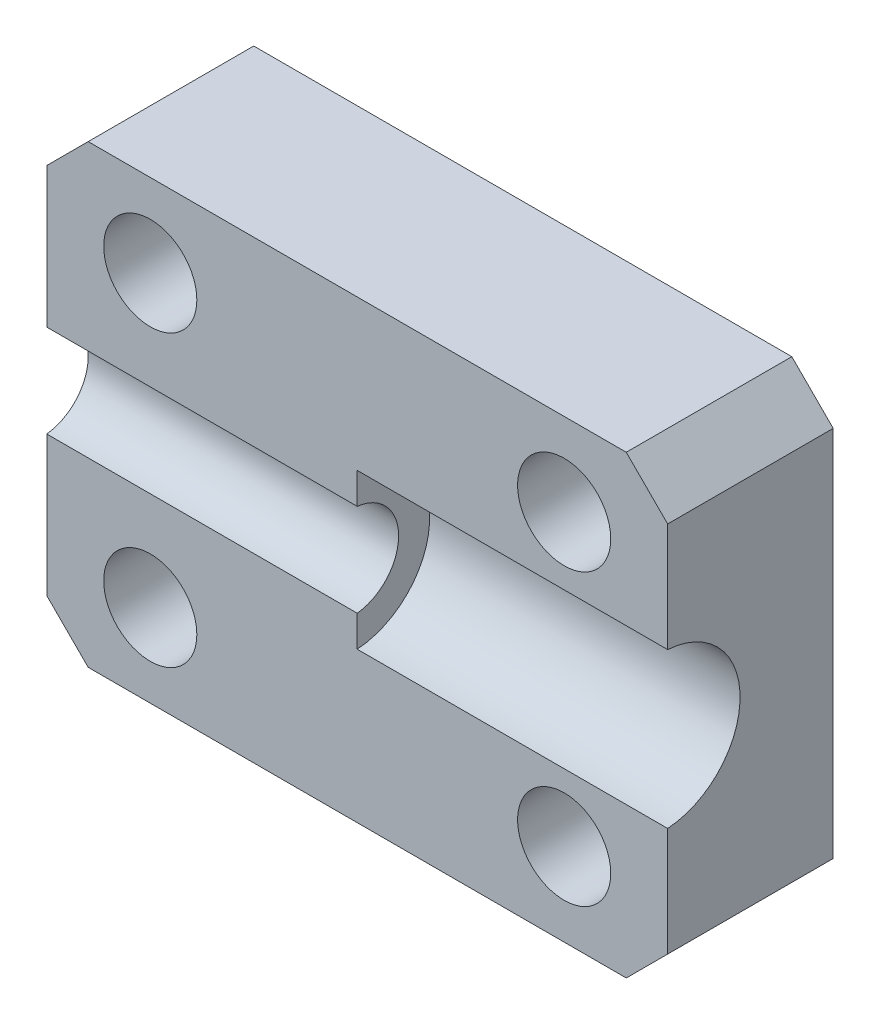
ISO-10303-21;
HEADER;
FILE_DESCRIPTION(('STEP AP214'),'2;1');
FILE_NAME('part.step','',(''),(''),'','','');
FILE_SCHEMA(('AUTOMOTIVE_DESIGN { 1 0 10303 214 1 1 1 1 }'));
ENDSEC;
DATA;
#1=APPLICATION_CONTEXT('core data for automotive mechanical design processes');
#2=APPLICATION_PROTOCOL_DEFINITION('international standard','automotive_design',2000,#1);
#3=PRODUCT_CONTEXT('',#1,'mechanical');
#4=PRODUCT('Part','Part','',(#3));
#5=PRODUCT_RELATED_PRODUCT_CATEGORY('part','',(#4));
#6=PRODUCT_DEFINITION_FORMATION('','',#4);
#7=PRODUCT_DEFINITION_CONTEXT('part definition',#1,'design');
#8=PRODUCT_DEFINITION('design','',#6,#7);
#9=PRODUCT_DEFINITION_SHAPE('','',#8);
#10=(LENGTH_UNIT() NAMED_UNIT(*) SI_UNIT(.MILLI.,.METRE.));
#11=(NAMED_UNIT(*) PLANE_ANGLE_UNIT() SI_UNIT($,.RADIAN.));
#12=(NAMED_UNIT(*) SI_UNIT($,.STERADIAN.) SOLID_ANGLE_UNIT());
#13=UNCERTAINTY_MEASURE_WITH_UNIT(LENGTH_MEASURE(1.E-05),#10,'distance_accuracy_value','');
#14=(GEOMETRIC_REPRESENTATION_CONTEXT(3) GLOBAL_UNCERTAINTY_ASSIGNED_CONTEXT((#13)) GLOBAL_UNIT_ASSIGNED_CONTEXT((#10,
#11,#12)) REPRESENTATION_CONTEXT('',''));
#15=CARTESIAN_POINT('',(0.,0.,0.));
#16=DIRECTION('',(0.,0.,1.));
#17=DIRECTION('',(1.,0.,0.));
#18=AXIS2_PLACEMENT_3D('',#15,#16,#17);
#19=CARTESIAN_POINT('',(-15.001,0.,8.25));
#20=DIRECTION('',(1.,0.,0.));
#21=DIRECTION('',(0.,1.,0.));
#22=AXIS2_PLACEMENT_3D('',#19,#20,#21);
#23=CYLINDRICAL_SURFACE('',#22,2.25);
#24=CARTESIAN_POINT('',(0.,0.,8.25));
#25=DIRECTION('',(1.,0.,0.));
#26=DIRECTION('',(0.,1.,0.));
#27=AXIS2_PLACEMENT_3D('',#24,#25,#26);
#28=CIRCLE('',#27,2.25);
#29=CARTESIAN_POINT('',(0.,2.23606797749978,8.));
#30=VERTEX_POINT('',#29);
#31=CARTESIAN_POINT('',(0.,-2.2360679774998,8.));
#32=VERTEX_POINT('',#31);
#33=EDGE_CURVE('E11',#30,#32,#28,.F.);
#34=ORIENTED_EDGE('',*,*,#33,.F.);
#35=DIRECTION('',(1.,0.,0.));
#36=VECTOR('',#35,1.);
#37=CARTESIAN_POINT('',(-15.001,2.23606797749978,8.));
#38=LINE('',#37,#36);
#39=CARTESIAN_POINT('',(-15.,2.23606797749978,8.));
#40=VERTEX_POINT('',#39);
#41=EDGE_CURVE('E231',#30,#40,#38,.F.);
#42=ORIENTED_EDGE('',*,*,#41,.T.);
#43=CARTESIAN_POINT('',(-15.,0.,8.25));
#44=DIRECTION('',(1.,0.,0.));
#45=DIRECTION('',(0.,0.,-1.));
#46=AXIS2_PLACEMENT_3D('',#43,#44,#45);
#47=CIRCLE('',#46,2.25);
#48=CARTESIAN_POINT('',(-15.,-2.2360679774998,8.));
#49=VERTEX_POINT('',#48);
#50=EDGE_CURVE('E226',#40,#49,#47,.F.);
#51=ORIENTED_EDGE('',*,*,#50,.T.);
#52=DIRECTION('',(1.,0.,0.));
#53=VECTOR('',#52,1.);
#54=CARTESIAN_POINT('',(-15.001,-2.2360679774998,8.));
#55=LINE('',#54,#53);
#56=EDGE_CURVE('E234',#49,#32,#55,.T.);
#57=ORIENTED_EDGE('',*,*,#56,.T.);
#58=EDGE_LOOP('',(#34,#42,#51,#57));
#59=FACE_BOUND('',#58,.T.);
#60=ADVANCED_FACE('F32',(#59),#23,.F.);
#61=CARTESIAN_POINT('',(0.,0.,8.));
#62=DIRECTION('',(0.,0.,-1.));
#63=DIRECTION('',(-1.,0.,0.));
#64=AXIS2_PLACEMENT_3D('',#61,#62,#63);
#65=PLANE('',#64);
#66=CARTESIAN_POINT('',(-10.,7.,8.));
#67=DIRECTION('',(0.,0.,1.));
#68=DIRECTION('',(1.,0.,0.));
#69=AXIS2_PLACEMENT_3D('',#66,#67,#68);
#70=CIRCLE('',#69,2.25);
#71=CARTESIAN_POINT('',(-7.75,7.,8.));
#72=VERTEX_POINT('',#71);
#73=EDGE_CURVE('E150',#72,#72,#70,.T.);
#74=ORIENTED_EDGE('',*,*,#73,.F.);
#75=EDGE_LOOP('',(#74));
#76=FACE_BOUND('',#75,.T.);
#77=CARTESIAN_POINT('',(10.,7.,8.));
#78=DIRECTION('',(0.,0.,1.));
#79=DIRECTION('',(1.,0.,0.));
#80=AXIS2_PLACEMENT_3D('',#77,#78,#79);
#81=CIRCLE('',#80,2.25);
#82=CARTESIAN_POINT('',(12.25,7.,8.));
#83=VERTEX_POINT('',#82);
#84=EDGE_CURVE('E214',#83,#83,#81,.T.);
#85=ORIENTED_EDGE('',*,*,#84,.F.);
#86=EDGE_LOOP('',(#85));
#87=FACE_BOUND('',#86,.T.);
#88=DIRECTION('',(0.,-1.,0.));
#89=VECTOR('',#88,1.);
#90=CARTESIAN_POINT('',(0.,0.,8.));
#91=LINE('',#90,#89);
#92=CARTESIAN_POINT('',(0.,3.74165738677394,8.));
#93=VERTEX_POINT('',#92);
#94=EDGE_CURVE('E46',#93,#30,#91,.T.);
#95=ORIENTED_EDGE('',*,*,#94,.F.);
#96=DIRECTION('',(1.,0.,0.));
#97=VECTOR('',#96,1.);
#98=CARTESIAN_POINT('',(0.,3.74165738677394,8.));
#99=LINE('',#98,#97);
#100=CARTESIAN_POINT('',(15.,3.74165738677394,8.));
#101=VERTEX_POINT('',#100);
#102=EDGE_CURVE('E122',#93,#101,#99,.T.);
#103=ORIENTED_EDGE('',*,*,#102,.T.);
#104=DIRECTION('',(0.,1.,0.));
#105=VECTOR('',#104,1.);
#106=CARTESIAN_POINT('',(15.,9.,8.));
#107=LINE('',#106,#105);
#108=CARTESIAN_POINT('',(15.,9.,8.));
#109=VERTEX_POINT('',#108);
#110=EDGE_CURVE('E114',#101,#109,#107,.T.);
#111=ORIENTED_EDGE('',*,*,#110,.T.);
#112=DIRECTION('',(-0.707106781186548,0.707106781186548,0.));
#113=VECTOR('',#112,1.);
#114=CARTESIAN_POINT('',(13.,11.,8.));
#115=LINE('',#114,#113);
#116=CARTESIAN_POINT('',(13.,11.,8.));
#117=VERTEX_POINT('',#116);
#118=EDGE_CURVE('E118',#109,#117,#115,.T.);
#119=ORIENTED_EDGE('',*,*,#118,.T.);
#120=DIRECTION('',(-1.,0.,0.));
#121=VECTOR('',#120,1.);
#122=CARTESIAN_POINT('',(-13.,11.,8.));
#123=LINE('',#122,#121);
#124=CARTESIAN_POINT('',(-13.,11.,8.));
#125=VERTEX_POINT('',#124);
#126=EDGE_CURVE('E55',#117,#125,#123,.T.);
#127=ORIENTED_EDGE('',*,*,#126,.T.);
#128=DIRECTION('',(-0.707106781186547,-0.707106781186548,0.));
#129=VECTOR('',#128,1.);
#130=CARTESIAN_POINT('',(-15.,9.,8.));
#131=LINE('',#130,#129);
#132=CARTESIAN_POINT('',(-15.,9.,8.));
#133=VERTEX_POINT('',#132);
#134=EDGE_CURVE('E162',#125,#133,#131,.T.);
#135=ORIENTED_EDGE('',*,*,#134,.T.);
#136=DIRECTION('',(0.,-1.,0.));
#137=VECTOR('',#136,1.);
#138=CARTESIAN_POINT('',(-15.,9.,8.));
#139=LINE('',#138,#137);
#140=EDGE_CURVE('E97',#133,#40,#139,.T.);
#141=ORIENTED_EDGE('',*,*,#140,.T.);
#142=ORIENTED_EDGE('',*,*,#41,.F.);
#143=EDGE_LOOP('',(#95,#103,#111,#119,#127,#135,#141,#142));
#144=FACE_BOUND('',#143,.T.);
#145=ADVANCED_FACE('F116',(#76,#87,#144),#65,.F.);
#146=CARTESIAN_POINT('',(15.,-9.,8.));
#147=VERTEX_POINT('',#146);
#148=CARTESIAN_POINT('',(15.,-3.74165738677395,8.));
#149=VERTEX_POINT('',#148);
#150=EDGE_CURVE('E125',#147,#149,#107,.T.);
#151=ORIENTED_EDGE('',*,*,#150,.T.);
#152=DIRECTION('',(1.,0.,0.));
#153=VECTOR('',#152,1.);
#154=CARTESIAN_POINT('',(0.,-3.74165738677394,8.));
#155=LINE('',#154,#153);
#156=CARTESIAN_POINT('',(0.,-3.74165738677394,8.));
#157=VERTEX_POINT('',#156);
#158=EDGE_CURVE('E238',#149,#157,#155,.F.);
#159=ORIENTED_EDGE('',*,*,#158,.T.);
#160=DIRECTION('',(0.,-1.,0.));
#161=VECTOR('',#160,1.);
#162=CARTESIAN_POINT('',(0.,0.,8.));
#163=LINE('',#162,#161);
#164=EDGE_CURVE('E242',#32,#157,#163,.T.);
#165=ORIENTED_EDGE('',*,*,#164,.F.);
#166=ORIENTED_EDGE('',*,*,#56,.F.);
#167=CARTESIAN_POINT('',(-15.,-9.,8.));
#168=VERTEX_POINT('',#167);
#169=EDGE_CURVE('E203',#49,#168,#139,.T.);
#170=ORIENTED_EDGE('',*,*,#169,.T.);
#171=DIRECTION('',(0.707106781186548,-0.707106781186547,0.));
#172=VECTOR('',#171,1.);
#173=CARTESIAN_POINT('',(-15.,-9.,8.));
#174=LINE('',#173,#172);
#175=CARTESIAN_POINT('',(-13.,-11.,8.));
#176=VERTEX_POINT('',#175);
#177=EDGE_CURVE('E198',#168,#176,#174,.T.);
#178=ORIENTED_EDGE('',*,*,#177,.T.);
#179=DIRECTION('',(1.,0.,0.));
#180=VECTOR('',#179,1.);
#181=CARTESIAN_POINT('',(-13.,-11.,8.));
#182=LINE('',#181,#180);
#183=CARTESIAN_POINT('',(13.,-11.,8.));
#184=VERTEX_POINT('',#183);
#185=EDGE_CURVE('E195',#176,#184,#182,.T.);
#186=ORIENTED_EDGE('',*,*,#185,.T.);
#187=DIRECTION('',(0.707106781186547,0.707106781186548,0.));
#188=VECTOR('',#187,1.);
#189=CARTESIAN_POINT('',(13.,-11.,8.));
#190=LINE('',#189,#188);
#191=EDGE_CURVE('E126',#184,#147,#190,.T.);
#192=ORIENTED_EDGE('',*,*,#191,.T.);
#193=EDGE_LOOP('',(#151,#159,#165,#166,#170,#178,#186,#192));
#194=FACE_BOUND('',#193,.T.);
#195=CARTESIAN_POINT('',(-10.,-7.,8.));
#196=DIRECTION('',(0.,0.,1.));
#197=DIRECTION('',(1.,0.,0.));
#198=AXIS2_PLACEMENT_3D('',#195,#196,#197);
#199=CIRCLE('',#198,2.25);
#200=CARTESIAN_POINT('',(-7.75,-7.,8.));
#201=VERTEX_POINT('',#200);
#202=EDGE_CURVE('E208',#201,#201,#199,.T.);
#203=ORIENTED_EDGE('',*,*,#202,.F.);
#204=EDGE_LOOP('',(#203));
#205=FACE_BOUND('',#204,.T.);
#206=CARTESIAN_POINT('',(10.,-7.,8.));
#207=DIRECTION('',(0.,0.,1.));
#208=DIRECTION('',(1.,0.,0.));
#209=AXIS2_PLACEMENT_3D('',#206,#207,#208);
#210=CIRCLE('',#209,2.25);
#211=CARTESIAN_POINT('',(12.25,-7.,8.));
#212=VERTEX_POINT('',#211);
#213=EDGE_CURVE('E220',#212,#212,#210,.T.);
#214=ORIENTED_EDGE('',*,*,#213,.F.);
#215=EDGE_LOOP('',(#214));
#216=FACE_BOUND('',#215,.T.);
#217=ADVANCED_FACE('F262',(#194,#205,#216),#65,.F.);
#218=CARTESIAN_POINT('',(0.,0.,0.));
#219=DIRECTION('',(0.,0.,-1.));
#220=DIRECTION('',(-1.,0.,0.));
#221=AXIS2_PLACEMENT_3D('',#218,#219,#220);
#222=PLANE('',#221);
#223=CARTESIAN_POINT('',(10.,7.,0.));
#224=DIRECTION('',(0.,0.,1.));
#225=DIRECTION('',(1.,0.,0.));
#226=AXIS2_PLACEMENT_3D('',#223,#224,#225);
#227=CIRCLE('',#226,2.25);
#228=CARTESIAN_POINT('',(12.25,7.,0.));
#229=VERTEX_POINT('',#228);
#230=EDGE_CURVE('E217',#229,#229,#227,.T.);
#231=ORIENTED_EDGE('',*,*,#230,.T.);
#232=EDGE_LOOP('',(#231));
#233=FACE_BOUND('',#232,.T.);
#234=CARTESIAN_POINT('',(-10.,7.,0.));
#235=DIRECTION('',(0.,0.,1.));
#236=DIRECTION('',(1.,0.,0.));
#237=AXIS2_PLACEMENT_3D('',#234,#235,#236);
#238=CIRCLE('',#237,2.25);
#239=CARTESIAN_POINT('',(-7.75,7.,0.));
#240=VERTEX_POINT('',#239);
#241=EDGE_CURVE('E205',#240,#240,#238,.T.);
#242=ORIENTED_EDGE('',*,*,#241,.T.);
#243=EDGE_LOOP('',(#242));
#244=FACE_BOUND('',#243,.T.);
#245=DIRECTION('',(-0.707106781186547,-0.707106781186548,0.));
#246=VECTOR('',#245,1.);
#247=CARTESIAN_POINT('',(-15.,9.,0.));
#248=LINE('',#247,#246);
#249=CARTESIAN_POINT('',(-13.,11.,0.));
#250=VERTEX_POINT('',#249);
#251=CARTESIAN_POINT('',(-15.,9.,0.));
#252=VERTEX_POINT('',#251);
#253=EDGE_CURVE('E146',#250,#252,#248,.T.);
#254=ORIENTED_EDGE('',*,*,#253,.F.);
#255=DIRECTION('',(-1.,0.,0.));
#256=VECTOR('',#255,1.);
#257=CARTESIAN_POINT('',(-13.,11.,0.));
#258=LINE('',#257,#256);
#259=CARTESIAN_POINT('',(13.,11.,0.));
#260=VERTEX_POINT('',#259);
#261=EDGE_CURVE('E88',#260,#250,#258,.T.);
#262=ORIENTED_EDGE('',*,*,#261,.F.);
#263=DIRECTION('',(-0.707106781186548,0.707106781186548,0.));
#264=VECTOR('',#263,1.);
#265=CARTESIAN_POINT('',(13.,11.,0.));
#266=LINE('',#265,#264);
#267=CARTESIAN_POINT('',(15.,9.,0.));
#268=VERTEX_POINT('',#267);
#269=EDGE_CURVE('E159',#268,#260,#266,.T.);
#270=ORIENTED_EDGE('',*,*,#269,.F.);
#271=DIRECTION('',(0.,1.,0.));
#272=VECTOR('',#271,1.);
#273=CARTESIAN_POINT('',(15.,9.,0.));
#274=LINE('',#273,#272);
#275=CARTESIAN_POINT('',(15.,-9.,0.));
#276=VERTEX_POINT('',#275);
#277=EDGE_CURVE('E133',#276,#268,#274,.T.);
#278=ORIENTED_EDGE('',*,*,#277,.F.);
#279=DIRECTION('',(0.707106781186547,0.707106781186548,0.));
#280=VECTOR('',#279,1.);
#281=CARTESIAN_POINT('',(13.,-11.,0.));
#282=LINE('',#281,#280);
#283=CARTESIAN_POINT('',(13.,-11.,0.));
#284=VERTEX_POINT('',#283);
#285=EDGE_CURVE('E156',#284,#276,#282,.T.);
#286=ORIENTED_EDGE('',*,*,#285,.F.);
#287=DIRECTION('',(1.,0.,0.));
#288=VECTOR('',#287,1.);
#289=CARTESIAN_POINT('',(-13.,-11.,0.));
#290=LINE('',#289,#288);
#291=CARTESIAN_POINT('',(-13.,-11.,0.));
#292=VERTEX_POINT('',#291);
#293=EDGE_CURVE('E154',#292,#284,#290,.T.);
#294=ORIENTED_EDGE('',*,*,#293,.F.);
#295=DIRECTION('',(0.707106781186548,-0.707106781186547,0.));
#296=VECTOR('',#295,1.);
#297=CARTESIAN_POINT('',(-15.,-9.,0.));
#298=LINE('',#297,#296);
#299=CARTESIAN_POINT('',(-15.,-9.,0.));
#300=VERTEX_POINT('',#299);
#301=EDGE_CURVE('E152',#300,#292,#298,.T.);
#302=ORIENTED_EDGE('',*,*,#301,.F.);
#303=DIRECTION('',(0.,-1.,0.));
#304=VECTOR('',#303,1.);
#305=CARTESIAN_POINT('',(-15.,9.,0.));
#306=LINE('',#305,#304);
#307=EDGE_CURVE('E149',#252,#300,#306,.T.);
#308=ORIENTED_EDGE('',*,*,#307,.F.);
#309=EDGE_LOOP('',(#254,#262,#270,#278,#286,#294,#302,#308));
#310=FACE_BOUND('',#309,.T.);
#311=CARTESIAN_POINT('',(-10.,-7.,0.));
#312=DIRECTION('',(0.,0.,1.));
#313=DIRECTION('',(1.,0.,0.));
#314=AXIS2_PLACEMENT_3D('',#311,#312,#313);
#315=CIRCLE('',#314,2.25);
#316=CARTESIAN_POINT('',(-7.75,-7.,0.));
#317=VERTEX_POINT('',#316);
#318=EDGE_CURVE('E211',#317,#317,#315,.T.);
#319=ORIENTED_EDGE('',*,*,#318,.T.);
#320=EDGE_LOOP('',(#319));
#321=FACE_BOUND('',#320,.T.);
#322=CARTESIAN_POINT('',(10.,-7.,0.));
#323=DIRECTION('',(0.,0.,1.));
#324=DIRECTION('',(1.,0.,0.));
#325=AXIS2_PLACEMENT_3D('',#322,#323,#324);
#326=CIRCLE('',#325,2.25);
#327=CARTESIAN_POINT('',(12.25,-7.,0.));
#328=VERTEX_POINT('',#327);
#329=EDGE_CURVE('E223',#328,#328,#326,.T.);
#330=ORIENTED_EDGE('',*,*,#329,.T.);
#331=EDGE_LOOP('',(#330));
#332=FACE_BOUND('',#331,.T.);
#333=ADVANCED_FACE('F182',(#233,#244,#310,#321,#332),#222,.T.);
#334=CARTESIAN_POINT('',(-15.,9.,8.));
#335=DIRECTION('',(0.707106781186548,-0.707106781186547,0.));
#336=DIRECTION('',(0.707106781186547,0.707106781186548,0.));
#337=AXIS2_PLACEMENT_3D('',#334,#335,#336);
#338=PLANE('',#337);
#339=ORIENTED_EDGE('',*,*,#253,.T.);
#340=DIRECTION('',(0.,0.,-1.));
#341=VECTOR('',#340,1.);
#342=CARTESIAN_POINT('',(-15.,9.,8.));
#343=LINE('',#342,#341);
#344=EDGE_CURVE('E40',#133,#252,#343,.T.);
#345=ORIENTED_EDGE('',*,*,#344,.F.);
#346=ORIENTED_EDGE('',*,*,#134,.F.);
#347=DIRECTION('',(0.,0.,-1.));
#348=VECTOR('',#347,1.);
#349=CARTESIAN_POINT('',(-13.,11.,8.));
#350=LINE('',#349,#348);
#351=EDGE_CURVE('E141',#125,#250,#350,.T.);
#352=ORIENTED_EDGE('',*,*,#351,.T.);
#353=EDGE_LOOP('',(#339,#345,#346,#352));
#354=FACE_BOUND('',#353,.T.);
#355=ADVANCED_FACE('F34',(#354),#338,.F.);
#356=CARTESIAN_POINT('',(-15.,9.,8.));
#357=DIRECTION('',(1.,0.,0.));
#358=DIRECTION('',(0.,0.,-1.));
#359=AXIS2_PLACEMENT_3D('',#356,#357,#358);
#360=PLANE('',#359);
#361=ORIENTED_EDGE('',*,*,#169,.F.);
#362=ORIENTED_EDGE('',*,*,#50,.F.);
#363=ORIENTED_EDGE('',*,*,#140,.F.);
#364=ORIENTED_EDGE('',*,*,#344,.T.);
#365=ORIENTED_EDGE('',*,*,#307,.T.);
#366=DIRECTION('',(0.,0.,-1.));
#367=VECTOR('',#366,1.);
#368=CARTESIAN_POINT('',(-15.,-9.,8.));
#369=LINE('',#368,#367);
#370=EDGE_CURVE('E172',#168,#300,#369,.T.);
#371=ORIENTED_EDGE('',*,*,#370,.F.);
#372=EDGE_LOOP('',(#361,#362,#363,#364,#365,#371));
#373=FACE_BOUND('',#372,.T.);
#374=ADVANCED_FACE('F176',(#373),#360,.F.);
#375=CARTESIAN_POINT('',(-15.,-9.,8.));
#376=DIRECTION('',(0.707106781186547,0.707106781186548,0.));
#377=DIRECTION('',(-0.707106781186548,0.707106781186547,0.));
#378=AXIS2_PLACEMENT_3D('',#375,#376,#377);
#379=PLANE('',#378);
#380=ORIENTED_EDGE('',*,*,#301,.T.);
#381=DIRECTION('',(0.,0.,-1.));
#382=VECTOR('',#381,1.);
#383=CARTESIAN_POINT('',(-13.,-11.,8.));
#384=LINE('',#383,#382);
#385=EDGE_CURVE('E169',#176,#292,#384,.T.);
#386=ORIENTED_EDGE('',*,*,#385,.F.);
#387=ORIENTED_EDGE('',*,*,#177,.F.);
#388=ORIENTED_EDGE('',*,*,#370,.T.);
#389=EDGE_LOOP('',(#380,#386,#387,#388));
#390=FACE_BOUND('',#389,.T.);
#391=ADVANCED_FACE('F189',(#390),#379,.F.);
#392=CARTESIAN_POINT('',(-13.,-11.,8.));
#393=DIRECTION('',(0.,1.,0.));
#394=DIRECTION('',(0.,0.,1.));
#395=AXIS2_PLACEMENT_3D('',#392,#393,#394);
#396=PLANE('',#395);
#397=ORIENTED_EDGE('',*,*,#293,.T.);
#398=DIRECTION('',(0.,0.,-1.));
#399=VECTOR('',#398,1.);
#400=CARTESIAN_POINT('',(13.,-11.,8.));
#401=LINE('',#400,#399);
#402=EDGE_CURVE('E166',#184,#284,#401,.T.);
#403=ORIENTED_EDGE('',*,*,#402,.F.);
#404=ORIENTED_EDGE('',*,*,#185,.F.);
#405=ORIENTED_EDGE('',*,*,#385,.T.);
#406=EDGE_LOOP('',(#397,#403,#404,#405));
#407=FACE_BOUND('',#406,.T.);
#408=ADVANCED_FACE('F193',(#407),#396,.F.);
#409=CARTESIAN_POINT('',(13.,-11.,8.));
#410=DIRECTION('',(-0.707106781186548,0.707106781186547,0.));
#411=DIRECTION('',(-0.707106781186547,-0.707106781186548,0.));
#412=AXIS2_PLACEMENT_3D('',#409,#410,#411);
#413=PLANE('',#412);
#414=ORIENTED_EDGE('',*,*,#285,.T.);
#415=DIRECTION('',(0.,0.,-1.));
#416=VECTOR('',#415,1.);
#417=CARTESIAN_POINT('',(15.,-9.,8.));
#418=LINE('',#417,#416);
#419=EDGE_CURVE('E136',#147,#276,#418,.T.);
#420=ORIENTED_EDGE('',*,*,#419,.F.);
#421=ORIENTED_EDGE('',*,*,#191,.F.);
#422=ORIENTED_EDGE('',*,*,#402,.T.);
#423=EDGE_LOOP('',(#414,#420,#421,#422));
#424=FACE_BOUND('',#423,.T.);
#425=ADVANCED_FACE('F273',(#424),#413,.F.);
#426=CARTESIAN_POINT('',(15.,9.,8.));
#427=DIRECTION('',(-1.,0.,0.));
#428=DIRECTION('',(0.,0.,1.));
#429=AXIS2_PLACEMENT_3D('',#426,#427,#428);
#430=PLANE('',#429);
#431=ORIENTED_EDGE('',*,*,#110,.F.);
#432=CARTESIAN_POINT('',(15.,0.,8.25));
#433=DIRECTION('',(1.,0.,0.));
#434=DIRECTION('',(0.,1.,0.));
#435=AXIS2_PLACEMENT_3D('',#432,#433,#434);
#436=CIRCLE('',#435,3.75);
#437=EDGE_CURVE('E246',#149,#101,#436,.T.);
#438=ORIENTED_EDGE('',*,*,#437,.F.);
#439=ORIENTED_EDGE('',*,*,#150,.F.);
#440=ORIENTED_EDGE('',*,*,#419,.T.);
#441=ORIENTED_EDGE('',*,*,#277,.T.);
#442=DIRECTION('',(0.,0.,-1.));
#443=VECTOR('',#442,1.);
#444=CARTESIAN_POINT('',(15.,9.,8.));
#445=LINE('',#444,#443);
#446=EDGE_CURVE('E129',#109,#268,#445,.T.);
#447=ORIENTED_EDGE('',*,*,#446,.F.);
#448=EDGE_LOOP('',(#431,#438,#439,#440,#441,#447));
#449=FACE_BOUND('',#448,.T.);
#450=ADVANCED_FACE('F130',(#449),#430,.F.);
#451=CARTESIAN_POINT('',(13.,11.,8.));
#452=DIRECTION('',(-0.707106781186547,-0.707106781186547,0.));
#453=DIRECTION('',(0.707106781186548,-0.707106781186548,0.));
#454=AXIS2_PLACEMENT_3D('',#451,#452,#453);
#455=PLANE('',#454);
#456=ORIENTED_EDGE('',*,*,#269,.T.);
#457=DIRECTION('',(0.,0.,-1.));
#458=VECTOR('',#457,1.);
#459=CARTESIAN_POINT('',(13.,11.,8.));
#460=LINE('',#459,#458);
#461=EDGE_CURVE('E137',#117,#260,#460,.T.);
#462=ORIENTED_EDGE('',*,*,#461,.F.);
#463=ORIENTED_EDGE('',*,*,#118,.F.);
#464=ORIENTED_EDGE('',*,*,#446,.T.);
#465=EDGE_LOOP('',(#456,#462,#463,#464));
#466=FACE_BOUND('',#465,.T.);
#467=ADVANCED_FACE('F139',(#466),#455,.F.);
#468=CARTESIAN_POINT('',(-13.,11.,8.));
#469=DIRECTION('',(0.,-1.,0.));
#470=DIRECTION('',(0.,0.,-1.));
#471=AXIS2_PLACEMENT_3D('',#468,#469,#470);
#472=PLANE('',#471);
#473=ORIENTED_EDGE('',*,*,#261,.T.);
#474=ORIENTED_EDGE('',*,*,#351,.F.);
#475=ORIENTED_EDGE('',*,*,#126,.F.);
#476=ORIENTED_EDGE('',*,*,#461,.T.);
#477=EDGE_LOOP('',(#473,#474,#475,#476));
#478=FACE_BOUND('',#477,.T.);
#479=ADVANCED_FACE('F274',(#478),#472,.F.);
#480=CARTESIAN_POINT('',(-10.,7.,8.));
#481=DIRECTION('',(0.,0.,-1.));
#482=DIRECTION('',(-1.,0.,0.));
#483=AXIS2_PLACEMENT_3D('',#480,#481,#482);
#484=CYLINDRICAL_SURFACE('',#483,2.25);
#485=ORIENTED_EDGE('',*,*,#73,.T.);
#486=EDGE_LOOP('',(#485));
#487=FACE_BOUND('',#486,.T.);
#488=ORIENTED_EDGE('',*,*,#241,.F.);
#489=EDGE_LOOP('',(#488));
#490=FACE_BOUND('',#489,.T.);
#491=ADVANCED_FACE('F276',(#487,#490),#484,.F.);
#492=CARTESIAN_POINT('',(-10.,-7.,8.));
#493=DIRECTION('',(0.,0.,-1.));
#494=DIRECTION('',(-1.,0.,0.));
#495=AXIS2_PLACEMENT_3D('',#492,#493,#494);
#496=CYLINDRICAL_SURFACE('',#495,2.25);
#497=ORIENTED_EDGE('',*,*,#202,.T.);
#498=EDGE_LOOP('',(#497));
#499=FACE_BOUND('',#498,.T.);
#500=ORIENTED_EDGE('',*,*,#318,.F.);
#501=EDGE_LOOP('',(#500));
#502=FACE_BOUND('',#501,.T.);
#503=ADVANCED_FACE('F282',(#499,#502),#496,.F.);
#504=CARTESIAN_POINT('',(10.,7.,8.));
#505=DIRECTION('',(0.,0.,-1.));
#506=DIRECTION('',(-1.,0.,0.));
#507=AXIS2_PLACEMENT_3D('',#504,#505,#506);
#508=CYLINDRICAL_SURFACE('',#507,2.25);
#509=ORIENTED_EDGE('',*,*,#84,.T.);
#510=EDGE_LOOP('',(#509));
#511=FACE_BOUND('',#510,.T.);
#512=ORIENTED_EDGE('',*,*,#230,.F.);
#513=EDGE_LOOP('',(#512));
#514=FACE_BOUND('',#513,.T.);
#515=ADVANCED_FACE('F300',(#511,#514),#508,.F.);
#516=CARTESIAN_POINT('',(10.,-7.,8.));
#517=DIRECTION('',(0.,0.,-1.));
#518=DIRECTION('',(-1.,0.,0.));
#519=AXIS2_PLACEMENT_3D('',#516,#517,#518);
#520=CYLINDRICAL_SURFACE('',#519,2.25);
#521=ORIENTED_EDGE('',*,*,#213,.T.);
#522=EDGE_LOOP('',(#521));
#523=FACE_BOUND('',#522,.T.);
#524=ORIENTED_EDGE('',*,*,#329,.F.);
#525=EDGE_LOOP('',(#524));
#526=FACE_BOUND('',#525,.T.);
#527=ADVANCED_FACE('F297',(#523,#526),#520,.F.);
#528=CARTESIAN_POINT('',(0.,0.,8.25));
#529=DIRECTION('',(1.,0.,0.));
#530=DIRECTION('',(0.,1.,0.));
#531=AXIS2_PLACEMENT_3D('',#528,#529,#530);
#532=CYLINDRICAL_SURFACE('',#531,3.75);
#533=CARTESIAN_POINT('',(0.,0.,8.25));
#534=DIRECTION('',(1.,0.,0.));
#535=DIRECTION('',(0.,1.,0.));
#536=AXIS2_PLACEMENT_3D('',#533,#534,#535);
#537=CIRCLE('',#536,3.75);
#538=EDGE_CURVE('E245',#157,#93,#537,.T.);
#539=ORIENTED_EDGE('',*,*,#538,.F.);
#540=ORIENTED_EDGE('',*,*,#158,.F.);
#541=ORIENTED_EDGE('',*,*,#437,.T.);
#542=ORIENTED_EDGE('',*,*,#102,.F.);
#543=EDGE_LOOP('',(#539,#540,#541,#542));
#544=FACE_BOUND('',#543,.T.);
#545=ADVANCED_FACE('F269',(#544),#532,.F.);
#546=CARTESIAN_POINT('',(0.,0.,8.25));
#547=DIRECTION('',(1.,0.,0.));
#548=DIRECTION('',(0.,1.,0.));
#549=AXIS2_PLACEMENT_3D('',#546,#547,#548);
#550=PLANE('',#549);
#551=ORIENTED_EDGE('',*,*,#94,.T.);
#552=ORIENTED_EDGE('',*,*,#33,.T.);
#553=ORIENTED_EDGE('',*,*,#164,.T.);
#554=ORIENTED_EDGE('',*,*,#538,.T.);
#555=EDGE_LOOP('',(#551,#552,#553,#554));
#556=FACE_BOUND('',#555,.T.);
#557=ADVANCED_FACE('F251',(#556),#550,.T.);
#558=CLOSED_SHELL('',(#60,#145,#217,#333,#355,#374,#391,#408,#425,#450,#467,#479,#491,#503,#515,
#527,#545,#557));
#559=MANIFOLD_SOLID_BREP('B2',#558);
#560=ADVANCED_BREP_SHAPE_REPRESENTATION('',(#18,#559),#14);
#561=SHAPE_DEFINITION_REPRESENTATION(#9,#560);
ENDSEC;
END-ISO-10303-21;
